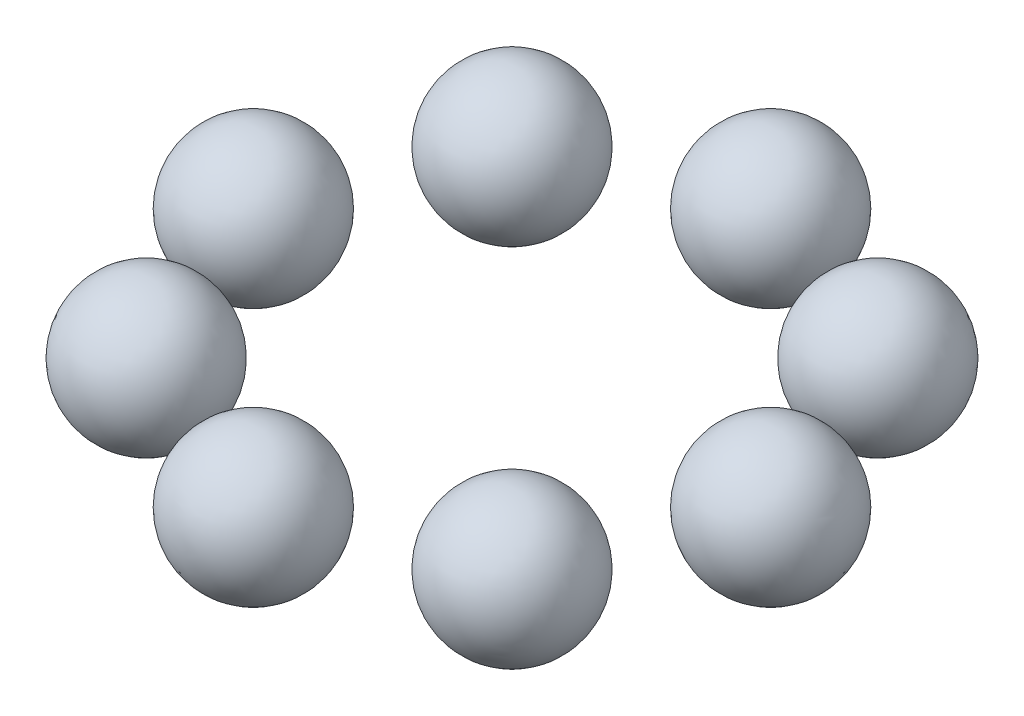
ISO-10303-21;
HEADER;
FILE_DESCRIPTION(('STEP AP214'),'2;1');
FILE_NAME('part.step','',(''),(''),'','','');
FILE_SCHEMA(('AUTOMOTIVE_DESIGN { 1 0 10303 214 1 1 1 1 }'));
ENDSEC;
DATA;
#1=APPLICATION_CONTEXT('core data for automotive mechanical design processes');
#2=APPLICATION_PROTOCOL_DEFINITION('international standard','automotive_design',2000,#1);
#3=PRODUCT_CONTEXT('',#1,'mechanical');
#4=PRODUCT('Part','Part','',(#3));
#5=PRODUCT_RELATED_PRODUCT_CATEGORY('part','',(#4));
#6=PRODUCT_DEFINITION_FORMATION('','',#4);
#7=PRODUCT_DEFINITION_CONTEXT('part definition',#1,'design');
#8=PRODUCT_DEFINITION('design','',#6,#7);
#9=PRODUCT_DEFINITION_SHAPE('','',#8);
#10=(LENGTH_UNIT() NAMED_UNIT(*) SI_UNIT(.MILLI.,.METRE.));
#11=(NAMED_UNIT(*) PLANE_ANGLE_UNIT() SI_UNIT($,.RADIAN.));
#12=(NAMED_UNIT(*) SI_UNIT($,.STERADIAN.) SOLID_ANGLE_UNIT());
#13=UNCERTAINTY_MEASURE_WITH_UNIT(LENGTH_MEASURE(1.E-05),#10,'distance_accuracy_value','');
#14=(GEOMETRIC_REPRESENTATION_CONTEXT(3) GLOBAL_UNCERTAINTY_ASSIGNED_CONTEXT((#13)) GLOBAL_UNIT_ASSIGNED_CONTEXT((#10,
#11,#12)) REPRESENTATION_CONTEXT('',''));
#15=CARTESIAN_POINT('',(0.,0.,0.));
#16=DIRECTION('',(0.,0.,1.));
#17=DIRECTION('',(1.,0.,0.));
#18=AXIS2_PLACEMENT_3D('',#15,#16,#17);
#19=CARTESIAN_POINT('',(7.3,0.,0.));
#20=DIRECTION('',(0.,1.,0.));
#21=DIRECTION('',(1.,0.,0.));
#22=AXIS2_PLACEMENT_3D('',#19,#20,#21);
#23=SPHERICAL_SURFACE('',#22,2.);
#24=CARTESIAN_POINT('',(7.3,2.,0.));
#25=VERTEX_POINT('',#24);
#26=VERTEX_LOOP('',#25);
#27=FACE_BOUND('',#26,.T.);
#28=ADVANCED_FACE('P0_F13',(#27),#23,.T.);
#29=CLOSED_SHELL('',(#28));
#30=MANIFOLD_SOLID_BREP('P0_B1',#29);
#31=CARTESIAN_POINT('',(5.16187950266179,0.,-5.16187950266181));
#32=DIRECTION('',(0.,1.,0.));
#33=DIRECTION('',(0.707106781186546,0.,-0.707106781186549));
#34=AXIS2_PLACEMENT_3D('',#31,#32,#33);
#35=SPHERICAL_SURFACE('',#34,2.);
#36=CARTESIAN_POINT('',(5.16187950266179,2.,-5.16187950266181));
#37=VERTEX_POINT('',#36);
#38=VERTEX_LOOP('',#37);
#39=FACE_BOUND('',#38,.T.);
#40=ADVANCED_FACE('P1_F13',(#39),#35,.T.);
#41=CLOSED_SHELL('',(#40));
#42=MANIFOLD_SOLID_BREP('P1_B1',#41);
#43=CARTESIAN_POINT('',(0.,0.,-7.3));
#44=DIRECTION('',(0.,1.,0.));
#45=DIRECTION('',(0.,0.,-1.));
#46=AXIS2_PLACEMENT_3D('',#43,#44,#45);
#47=SPHERICAL_SURFACE('',#46,2.);
#48=CARTESIAN_POINT('',(0.,2.,-7.3));
#49=VERTEX_POINT('',#48);
#50=VERTEX_LOOP('',#49);
#51=FACE_BOUND('',#50,.T.);
#52=ADVANCED_FACE('P2_F13',(#51),#47,.T.);
#53=CLOSED_SHELL('',(#52));
#54=MANIFOLD_SOLID_BREP('P2_B1',#53);
#55=CARTESIAN_POINT('',(-5.16187950266182,0.,-5.16187950266177));
#56=DIRECTION('',(0.,1.,0.));
#57=DIRECTION('',(-0.707106781186551,0.,-0.707106781186544));
#58=AXIS2_PLACEMENT_3D('',#55,#56,#57);
#59=SPHERICAL_SURFACE('',#58,2.);
#60=CARTESIAN_POINT('',(-5.16187950266182,2.,-5.16187950266177));
#61=VERTEX_POINT('',#60);
#62=VERTEX_LOOP('',#61);
#63=FACE_BOUND('',#62,.T.);
#64=ADVANCED_FACE('P3_F13',(#63),#59,.T.);
#65=CLOSED_SHELL('',(#64));
#66=MANIFOLD_SOLID_BREP('P3_B1',#65);
#67=CARTESIAN_POINT('',(-7.3,0.,0.));
#68=DIRECTION('',(0.,1.,0.));
#69=DIRECTION('',(-1.,0.,0.));
#70=AXIS2_PLACEMENT_3D('',#67,#68,#69);
#71=SPHERICAL_SURFACE('',#70,2.);
#72=CARTESIAN_POINT('',(-7.3,2.,0.));
#73=VERTEX_POINT('',#72);
#74=VERTEX_LOOP('',#73);
#75=FACE_BOUND('',#74,.T.);
#76=ADVANCED_FACE('P4_F13',(#75),#71,.T.);
#77=CLOSED_SHELL('',(#76));
#78=MANIFOLD_SOLID_BREP('P4_B1',#77);
#79=CARTESIAN_POINT('',(-5.16187950266175,0.,5.16187950266184));
#80=DIRECTION('',(0.,1.,0.));
#81=DIRECTION('',(-0.707106781186541,0.,0.707106781186554));
#82=AXIS2_PLACEMENT_3D('',#79,#80,#81);
#83=SPHERICAL_SURFACE('',#82,2.);
#84=CARTESIAN_POINT('',(-5.16187950266175,2.,5.16187950266184));
#85=VERTEX_POINT('',#84);
#86=VERTEX_LOOP('',#85);
#87=FACE_BOUND('',#86,.T.);
#88=ADVANCED_FACE('P5_F13',(#87),#83,.T.);
#89=CLOSED_SHELL('',(#88));
#90=MANIFOLD_SOLID_BREP('P5_B1',#89);
#91=CARTESIAN_POINT('',(0.,0.,7.3));
#92=DIRECTION('',(0.,1.,0.));
#93=DIRECTION('',(0.,0.,1.));
#94=AXIS2_PLACEMENT_3D('',#91,#92,#93);
#95=SPHERICAL_SURFACE('',#94,2.);
#96=CARTESIAN_POINT('',(0.,2.,7.3));
#97=VERTEX_POINT('',#96);
#98=VERTEX_LOOP('',#97);
#99=FACE_BOUND('',#98,.T.);
#100=ADVANCED_FACE('P6_F13',(#99),#95,.T.);
#101=CLOSED_SHELL('',(#100));
#102=MANIFOLD_SOLID_BREP('P6_B1',#101);
#103=CARTESIAN_POINT('',(5.16187950266186,0.,5.16187950266173));
#104=DIRECTION('',(0.,1.,0.));
#105=DIRECTION('',(0.707106781186556,0.,0.707106781186539));
#106=AXIS2_PLACEMENT_3D('',#103,#104,#105);
#107=SPHERICAL_SURFACE('',#106,2.);
#108=CARTESIAN_POINT('',(5.16187950266186,2.,5.16187950266173));
#109=VERTEX_POINT('',#108);
#110=VERTEX_LOOP('',#109);
#111=FACE_BOUND('',#110,.T.);
#112=ADVANCED_FACE('P7_F12',(#111),#107,.T.);
#113=CLOSED_SHELL('',(#112));
#114=MANIFOLD_SOLID_BREP('P7_B1',#113);
#115=ADVANCED_BREP_SHAPE_REPRESENTATION('',(#18,#30,#42,#54,#66,#78,#90,#102,#114),#14);
#116=SHAPE_DEFINITION_REPRESENTATION(#9,#115);
ENDSEC;
END-ISO-10303-21;
